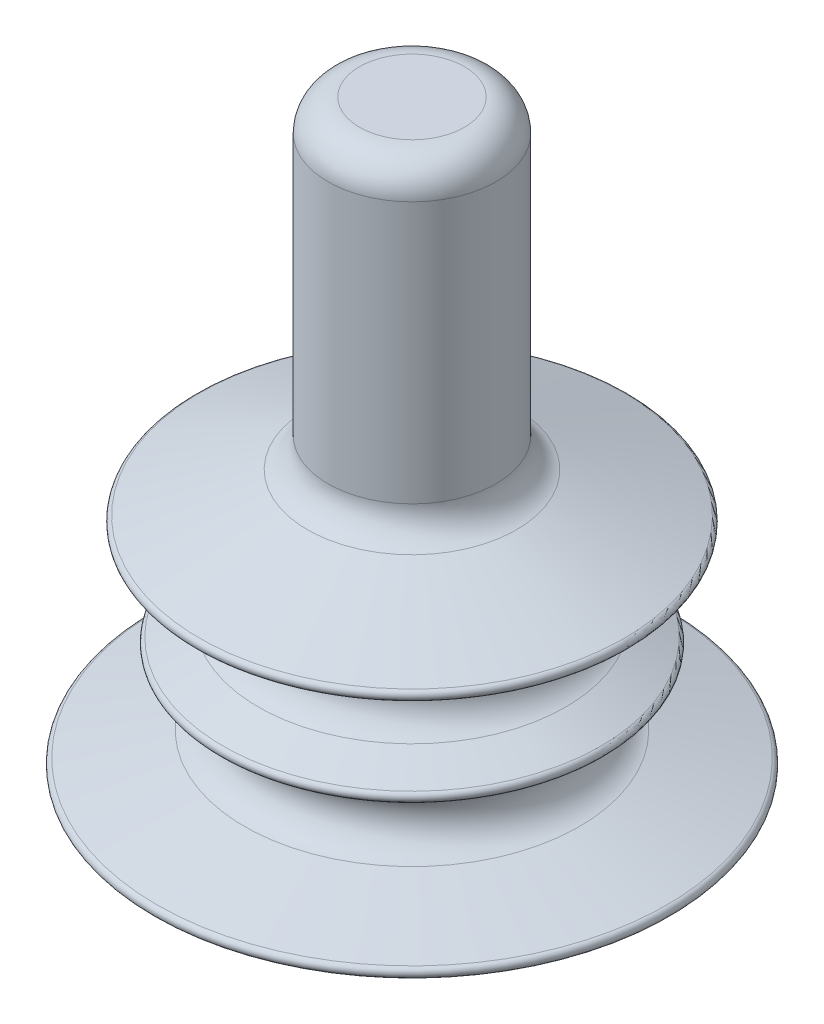
ISO-10303-21;
HEADER;
FILE_DESCRIPTION(('STEP AP214'),'2;1');
FILE_NAME('part.step','',(''),(''),'','','');
FILE_SCHEMA(('AUTOMOTIVE_DESIGN { 1 0 10303 214 1 1 1 1 }'));
ENDSEC;
DATA;
#1=APPLICATION_CONTEXT('core data for automotive mechanical design processes');
#2=APPLICATION_PROTOCOL_DEFINITION('international standard','automotive_design',2000,#1);
#3=PRODUCT_CONTEXT('',#1,'mechanical');
#4=PRODUCT('Part','Part','',(#3));
#5=PRODUCT_RELATED_PRODUCT_CATEGORY('part','',(#4));
#6=PRODUCT_DEFINITION_FORMATION('','',#4);
#7=PRODUCT_DEFINITION_CONTEXT('part definition',#1,'design');
#8=PRODUCT_DEFINITION('design','',#6,#7);
#9=PRODUCT_DEFINITION_SHAPE('','',#8);
#10=(LENGTH_UNIT() NAMED_UNIT(*) SI_UNIT(.MILLI.,.METRE.));
#11=(NAMED_UNIT(*) PLANE_ANGLE_UNIT() SI_UNIT($,.RADIAN.));
#12=(NAMED_UNIT(*) SI_UNIT($,.STERADIAN.) SOLID_ANGLE_UNIT());
#13=UNCERTAINTY_MEASURE_WITH_UNIT(LENGTH_MEASURE(1.E-05),#10,'distance_accuracy_value','');
#14=(GEOMETRIC_REPRESENTATION_CONTEXT(3) GLOBAL_UNCERTAINTY_ASSIGNED_CONTEXT((#13)) GLOBAL_UNIT_ASSIGNED_CONTEXT((#10,
#11,#12)) REPRESENTATION_CONTEXT('',''));
#15=CARTESIAN_POINT('',(0.,0.,0.));
#16=DIRECTION('',(0.,0.,1.));
#17=DIRECTION('',(1.,0.,0.));
#18=AXIS2_PLACEMENT_3D('',#15,#16,#17);
#19=CARTESIAN_POINT('',(0.,65.,0.));
#20=DIRECTION('',(0.,-1.,0.));
#21=DIRECTION('',(0.,0.,-1.));
#22=AXIS2_PLACEMENT_3D('',#19,#20,#21);
#23=PLANE('',#22);
#24=CARTESIAN_POINT('',(0.,65.,0.));
#25=DIRECTION('',(0.,-1.,0.));
#26=DIRECTION('',(0.,0.,-1.));
#27=AXIS2_PLACEMENT_3D('',#24,#25,#26);
#28=CIRCLE('',#27,5.);
#29=CARTESIAN_POINT('',(0.,65.,-5.));
#30=VERTEX_POINT('',#29);
#31=EDGE_CURVE('E10',#30,#30,#28,.F.);
#32=ORIENTED_EDGE('',*,*,#31,.T.);
#33=EDGE_LOOP('',(#32));
#34=FACE_BOUND('',#33,.T.);
#35=ADVANCED_FACE('F31',(#34),#23,.F.);
#36=CARTESIAN_POINT('',(0.,0.,0.));
#37=DIRECTION('',(0.,-1.,0.));
#38=DIRECTION('',(0.,0.,-1.));
#39=AXIS2_PLACEMENT_3D('',#36,#37,#38);
#40=CYLINDRICAL_SURFACE('',#39,8.);
#41=CARTESIAN_POINT('',(0.,37.088040010864,0.));
#42=DIRECTION('',(0.,-1.,0.));
#43=DIRECTION('',(0.,0.,-1.));
#44=AXIS2_PLACEMENT_3D('',#41,#42,#43);
#45=CIRCLE('',#44,8.);
#46=CARTESIAN_POINT('',(0.,37.088040010864,-8.));
#47=VERTEX_POINT('',#46);
#48=EDGE_CURVE('E38',#47,#47,#45,.F.);
#49=ORIENTED_EDGE('',*,*,#48,.T.);
#50=EDGE_LOOP('',(#49));
#51=FACE_BOUND('',#50,.T.);
#52=CARTESIAN_POINT('',(0.,62.,0.));
#53=DIRECTION('',(0.,-1.,0.));
#54=DIRECTION('',(0.,0.,-1.));
#55=AXIS2_PLACEMENT_3D('',#52,#53,#54);
#56=CIRCLE('',#55,8.);
#57=CARTESIAN_POINT('',(0.,62.,-8.));
#58=VERTEX_POINT('',#57);
#59=EDGE_CURVE('E42',#58,#58,#56,.T.);
#60=ORIENTED_EDGE('',*,*,#59,.T.);
#61=EDGE_LOOP('',(#60));
#62=FACE_BOUND('',#61,.T.);
#63=ADVANCED_FACE('F108',(#51,#62),#40,.T.);
#64=CARTESIAN_POINT('',(0.,35.,0.));
#65=DIRECTION('',(0.,-1.,0.));
#66=DIRECTION('',(0.,0.,-1.));
#67=AXIS2_PLACEMENT_3D('',#64,#65,#66);
#68=CONICAL_SURFACE('',#67,8.,1.21609067478396);
#69=CARTESIAN_POINT('',(0.,34.2747937286929,0.));
#70=DIRECTION('',(0.,-1.,0.));
#71=DIRECTION('',(0.,0.,-1.));
#72=AXIS2_PLACEMENT_3D('',#69,#70,#71);
#73=CIRCLE('',#72,9.95805693252922);
#74=CARTESIAN_POINT('',(0.,34.2747937286929,-9.95805693252922));
#75=VERTEX_POINT('',#74);
#76=EDGE_CURVE('E46',#75,#75,#73,.T.);
#77=ORIENTED_EDGE('',*,*,#76,.T.);
#78=EDGE_LOOP('',(#77));
#79=FACE_BOUND('',#78,.T.);
#80=CARTESIAN_POINT('',(0.,30.4688743803619,0.));
#81=DIRECTION('',(0.,-1.,0.));
#82=DIRECTION('',(0.,0.,-1.));
#83=AXIS2_PLACEMENT_3D('',#80,#81,#82);
#84=CIRCLE('',#83,20.234039173023);
#85=CARTESIAN_POINT('',(0.,30.4688743803619,-20.234039173023));
#86=VERTEX_POINT('',#85);
#87=EDGE_CURVE('E69',#86,#86,#84,.T.);
#88=ORIENTED_EDGE('',*,*,#87,.F.);
#89=EDGE_LOOP('',(#88));
#90=FACE_BOUND('',#89,.T.);
#91=ADVANCED_FACE('F113',(#79,#90),#68,.T.);
#92=CARTESIAN_POINT('',(0.,30.,0.));
#93=DIRECTION('',(0.,-1.,0.));
#94=DIRECTION('',(0.,0.,-1.));
#95=AXIS2_PLACEMENT_3D('',#92,#93,#94);
#96=TOROIDAL_SURFACE('',#95,20.0603819951112,0.500000000000001);
#97=CARTESIAN_POINT('',(0.,29.5311256196381,0.));
#98=DIRECTION('',(0.,-1.,0.));
#99=DIRECTION('',(0.,0.,-1.));
#100=AXIS2_PLACEMENT_3D('',#97,#98,#99);
#101=CIRCLE('',#100,20.234039173023);
#102=CARTESIAN_POINT('',(0.,29.5311256196381,-20.234039173023));
#103=VERTEX_POINT('',#102);
#104=EDGE_CURVE('E72',#103,#103,#101,.T.);
#105=ORIENTED_EDGE('',*,*,#104,.F.);
#106=EDGE_LOOP('',(#105));
#107=FACE_BOUND('',#106,.T.);
#108=ORIENTED_EDGE('',*,*,#87,.T.);
#109=EDGE_LOOP('',(#108));
#110=FACE_BOUND('',#109,.T.);
#111=ADVANCED_FACE('F139',(#107,#110),#96,.T.);
#112=CARTESIAN_POINT('',(0.,29.5311256196381,0.));
#113=DIRECTION('',(0.,1.,0.));
#114=DIRECTION('',(0.,0.,1.));
#115=AXIS2_PLACEMENT_3D('',#112,#113,#114);
#116=CONICAL_SURFACE('',#115,20.234039173023,1.21609067478396);
#117=CARTESIAN_POINT('',(0.,27.5300053749923,0.));
#118=DIRECTION('',(0.,1.,0.));
#119=DIRECTION('',(0.,0.,1.));
#120=AXIS2_PLACEMENT_3D('',#117,#118,#119);
#121=CIRCLE('',#120,14.8310145124793);
#122=CARTESIAN_POINT('',(0.,27.5300053749923,14.8310145124793));
#123=VERTEX_POINT('',#122);
#124=EDGE_CURVE('E51',#123,#123,#121,.T.);
#125=ORIENTED_EDGE('',*,*,#124,.T.);
#126=EDGE_LOOP('',(#125));
#127=FACE_BOUND('',#126,.T.);
#128=ORIENTED_EDGE('',*,*,#104,.T.);
#129=EDGE_LOOP('',(#128));
#130=FACE_BOUND('',#129,.T.);
#131=ADVANCED_FACE('F143',(#127,#130),#116,.T.);
#132=CARTESIAN_POINT('',(0.,25.,0.));
#133=DIRECTION('',(0.,-1.,0.));
#134=DIRECTION('',(0.,0.,-1.));
#135=AXIS2_PLACEMENT_3D('',#132,#133,#134);
#136=CONICAL_SURFACE('',#135,8.,1.14416883366802);
#137=CARTESIAN_POINT('',(0.,21.9856596604334,0.));
#138=DIRECTION('',(0.,-1.,0.));
#139=DIRECTION('',(0.,0.,-1.));
#140=AXIS2_PLACEMENT_3D('',#137,#138,#139);
#141=CIRCLE('',#140,14.6315487470465);
#142=CARTESIAN_POINT('',(0.,21.9856596604334,-14.6315487470465));
#143=VERTEX_POINT('',#142);
#144=EDGE_CURVE('E54',#143,#143,#141,.T.);
#145=ORIENTED_EDGE('',*,*,#144,.T.);
#146=EDGE_LOOP('',(#145));
#147=FACE_BOUND('',#146,.T.);
#148=CARTESIAN_POINT('',(0.,20.4551832387313,0.));
#149=DIRECTION('',(0.,-1.,0.));
#150=DIRECTION('',(0.,0.,-1.));
#151=AXIS2_PLACEMENT_3D('',#148,#149,#150);
#152=CIRCLE('',#151,17.9985968747911);
#153=CARTESIAN_POINT('',(0.,20.4551832387313,-17.9985968747911));
#154=VERTEX_POINT('',#153);
#155=EDGE_CURVE('E75',#154,#154,#152,.T.);
#156=ORIENTED_EDGE('',*,*,#155,.F.);
#157=EDGE_LOOP('',(#156));
#158=FACE_BOUND('',#157,.T.);
#159=ADVANCED_FACE('F149',(#147,#158),#136,.T.);
#160=CARTESIAN_POINT('',(0.,20.,0.));
#161=DIRECTION('',(0.,-1.,0.));
#162=DIRECTION('',(0.,0.,-1.));
#163=AXIS2_PLACEMENT_3D('',#160,#161,#162);
#164=TOROIDAL_SURFACE('',#163,17.7916954026405,0.500000000000001);
#165=CARTESIAN_POINT('',(0.,19.5448167612687,0.));
#166=DIRECTION('',(0.,-1.,0.));
#167=DIRECTION('',(0.,0.,-1.));
#168=AXIS2_PLACEMENT_3D('',#165,#166,#167);
#169=CIRCLE('',#168,17.9985968747911);
#170=CARTESIAN_POINT('',(0.,19.5448167612687,-17.9985968747911));
#171=VERTEX_POINT('',#170);
#172=EDGE_CURVE('E78',#171,#171,#169,.T.);
#173=ORIENTED_EDGE('',*,*,#172,.F.);
#174=EDGE_LOOP('',(#173));
#175=FACE_BOUND('',#174,.T.);
#176=ORIENTED_EDGE('',*,*,#155,.T.);
#177=EDGE_LOOP('',(#176));
#178=FACE_BOUND('',#177,.T.);
#179=ADVANCED_FACE('F156',(#175,#178),#164,.T.);
#180=CARTESIAN_POINT('',(0.,19.5448167612687,0.));
#181=DIRECTION('',(0.,1.,0.));
#182=DIRECTION('',(0.,0.,1.));
#183=AXIS2_PLACEMENT_3D('',#180,#181,#182);
#184=CONICAL_SURFACE('',#183,17.9985968747911,1.14416883366802);
#185=CARTESIAN_POINT('',(0.,18.413702437768,0.));
#186=DIRECTION('',(0.,1.,0.));
#187=DIRECTION('',(0.,0.,1.));
#188=AXIS2_PLACEMENT_3D('',#185,#186,#187);
#189=CIRCLE('',#188,15.5101453630895);
#190=CARTESIAN_POINT('',(0.,18.413702437768,15.5101453630895));
#191=VERTEX_POINT('',#190);
#192=EDGE_CURVE('E57',#191,#191,#189,.T.);
#193=ORIENTED_EDGE('',*,*,#192,.T.);
#194=EDGE_LOOP('',(#193));
#195=FACE_BOUND('',#194,.T.);
#196=ORIENTED_EDGE('',*,*,#172,.T.);
#197=EDGE_LOOP('',(#196));
#198=FACE_BOUND('',#197,.T.);
#199=ADVANCED_FACE('F160',(#195,#198),#184,.T.);
#200=CARTESIAN_POINT('',(0.,15.,0.));
#201=DIRECTION('',(0.,-1.,0.));
#202=DIRECTION('',(0.,0.,-1.));
#203=AXIS2_PLACEMENT_3D('',#200,#201,#202);
#204=CONICAL_SURFACE('',#203,8.00000000000001,1.29984947645648);
#205=CARTESIAN_POINT('',(0.,12.7920492764903,0.));
#206=DIRECTION('',(0.,-1.,0.));
#207=DIRECTION('',(0.,0.,-1.));
#208=AXIS2_PLACEMENT_3D('',#205,#206,#207);
#209=CIRCLE('',#208,15.9486226046348);
#210=CARTESIAN_POINT('',(0.,12.7920492764903,-15.9486226046348));
#211=VERTEX_POINT('',#210);
#212=EDGE_CURVE('E60',#211,#211,#209,.T.);
#213=ORIENTED_EDGE('',*,*,#212,.T.);
#214=EDGE_LOOP('',(#213));
#215=FACE_BOUND('',#214,.T.);
#216=CARTESIAN_POINT('',(0.,10.481758954815,0.));
#217=DIRECTION('',(0.,-1.,0.));
#218=DIRECTION('',(0.,0.,-1.));
#219=AXIS2_PLACEMENT_3D('',#216,#217,#218);
#220=CIRCLE('',#219,24.2656677626661);
#221=CARTESIAN_POINT('',(0.,10.481758954815,-24.2656677626661));
#222=VERTEX_POINT('',#221);
#223=EDGE_CURVE('E81',#222,#222,#220,.T.);
#224=ORIENTED_EDGE('',*,*,#223,.F.);
#225=EDGE_LOOP('',(#224));
#226=FACE_BOUND('',#225,.T.);
#227=ADVANCED_FACE('F164',(#215,#226),#204,.T.);
#228=CARTESIAN_POINT('',(0.,9.99999999999999,0.));
#229=DIRECTION('',(0.,-1.,0.));
#230=DIRECTION('',(0.,0.,-1.));
#231=AXIS2_PLACEMENT_3D('',#228,#229,#230);
#232=TOROIDAL_SURFACE('',#231,24.1318458307731,0.5);
#233=CARTESIAN_POINT('',(0.,9.51824104518503,0.));
#234=DIRECTION('',(0.,-1.,0.));
#235=DIRECTION('',(0.,0.,-1.));
#236=AXIS2_PLACEMENT_3D('',#233,#234,#235);
#237=CIRCLE('',#236,24.2656677626661);
#238=CARTESIAN_POINT('',(0.,9.51824104518503,-24.2656677626661));
#239=VERTEX_POINT('',#238);
#240=EDGE_CURVE('E84',#239,#239,#237,.T.);
#241=ORIENTED_EDGE('',*,*,#240,.F.);
#242=EDGE_LOOP('',(#241));
#243=FACE_BOUND('',#242,.T.);
#244=ORIENTED_EDGE('',*,*,#223,.T.);
#245=EDGE_LOOP('',(#244));
#246=FACE_BOUND('',#245,.T.);
#247=ADVANCED_FACE('F104',(#243,#246),#232,.T.);
#248=CARTESIAN_POINT('',(0.,9.51824104518503,0.));
#249=DIRECTION('',(0.,1.,0.));
#250=DIRECTION('',(0.,0.,1.));
#251=AXIS2_PLACEMENT_3D('',#248,#249,#250);
#252=CONICAL_SURFACE('',#251,24.2656677626661,1.29984947645648);
#253=CARTESIAN_POINT('',(0.,5.61029678017826,0.));
#254=DIRECTION('',(0.,1.,0.));
#255=DIRECTION('',(0.,0.,1.));
#256=AXIS2_PLACEMENT_3D('',#253,#254,#255);
#257=CIRCLE('',#256,10.1970684086417);
#258=CARTESIAN_POINT('',(0.,5.61029678017826,10.1970684086417));
#259=VERTEX_POINT('',#258);
#260=EDGE_CURVE('E63',#259,#259,#257,.T.);
#261=ORIENTED_EDGE('',*,*,#260,.T.);
#262=EDGE_LOOP('',(#261));
#263=FACE_BOUND('',#262,.T.);
#264=ORIENTED_EDGE('',*,*,#240,.T.);
#265=EDGE_LOOP('',(#264));
#266=FACE_BOUND('',#265,.T.);
#267=ADVANCED_FACE('F95',(#263,#266),#252,.T.);
#268=CARTESIAN_POINT('',(0.,0.,0.));
#269=DIRECTION('',(0.,-1.,0.));
#270=DIRECTION('',(0.,0.,-1.));
#271=AXIS2_PLACEMENT_3D('',#268,#269,#270);
#272=CYLINDRICAL_SURFACE('',#271,8.);
#273=CARTESIAN_POINT('',(0.,2.71974305128844,0.));
#274=DIRECTION('',(0.,-1.,0.));
#275=DIRECTION('',(0.,0.,-1.));
#276=AXIS2_PLACEMENT_3D('',#273,#274,#275);
#277=CIRCLE('',#276,8.);
#278=CARTESIAN_POINT('',(0.,2.71974305128844,-8.));
#279=VERTEX_POINT('',#278);
#280=EDGE_CURVE('E66',#279,#279,#277,.T.);
#281=ORIENTED_EDGE('',*,*,#280,.T.);
#282=EDGE_LOOP('',(#281));
#283=FACE_BOUND('',#282,.T.);
#284=CARTESIAN_POINT('',(0.,0.,0.));
#285=DIRECTION('',(0.,-1.,0.));
#286=DIRECTION('',(0.,0.,-1.));
#287=AXIS2_PLACEMENT_3D('',#284,#285,#286);
#288=CIRCLE('',#287,8.);
#289=CARTESIAN_POINT('',(0.,0.,-8.));
#290=VERTEX_POINT('',#289);
#291=EDGE_CURVE('E87',#290,#290,#288,.T.);
#292=ORIENTED_EDGE('',*,*,#291,.F.);
#293=EDGE_LOOP('',(#292));
#294=FACE_BOUND('',#293,.T.);
#295=ADVANCED_FACE('F93',(#283,#294),#272,.T.);
#296=CARTESIAN_POINT('',(0.,0.,8.));
#297=DIRECTION('',(0.,1.,0.));
#298=DIRECTION('',(0.,0.,1.));
#299=AXIS2_PLACEMENT_3D('',#296,#297,#298);
#300=PLANE('',#299);
#301=ORIENTED_EDGE('',*,*,#291,.T.);
#302=EDGE_LOOP('',(#301));
#303=FACE_BOUND('',#302,.T.);
#304=ADVANCED_FACE('F91',(#303),#300,.F.);
#305=CARTESIAN_POINT('',(0.,2.71974305128844,0.));
#306=DIRECTION('',(0.,-1.,0.));
#307=DIRECTION('',(0.,0.,-1.));
#308=AXIS2_PLACEMENT_3D('',#305,#306,#307);
#309=TOROIDAL_SURFACE('',#308,11.,3.);
#310=ORIENTED_EDGE('',*,*,#260,.F.);
#311=EDGE_LOOP('',(#310));
#312=FACE_BOUND('',#311,.T.);
#313=ORIENTED_EDGE('',*,*,#280,.F.);
#314=EDGE_LOOP('',(#313));
#315=FACE_BOUND('',#314,.T.);
#316=ADVANCED_FACE('F102',(#312,#315),#309,.F.);
#317=CARTESIAN_POINT('',(0.,15.6826030053802,0.));
#318=DIRECTION('',(0.,-1.,0.));
#319=DIRECTION('',(0.,0.,-1.));
#320=AXIS2_PLACEMENT_3D('',#317,#318,#319);
#321=TOROIDAL_SURFACE('',#320,16.7515541959931,3.);
#322=ORIENTED_EDGE('',*,*,#192,.F.);
#323=EDGE_LOOP('',(#322));
#324=FACE_BOUND('',#323,.T.);
#325=ORIENTED_EDGE('',*,*,#212,.F.);
#326=EDGE_LOOP('',(#325));
#327=FACE_BOUND('',#326,.T.);
#328=ADVANCED_FACE('F119',(#324,#327),#321,.F.);
#329=CARTESIAN_POINT('',(0.,24.7167590928212,0.));
#330=DIRECTION('',(0.,-1.,0.));
#331=DIRECTION('',(0.,0.,-1.));
#332=AXIS2_PLACEMENT_3D('',#329,#330,#331);
#333=TOROIDAL_SURFACE('',#332,15.8729575799501,3.);
#334=ORIENTED_EDGE('',*,*,#124,.F.);
#335=EDGE_LOOP('',(#334));
#336=FACE_BOUND('',#335,.T.);
#337=ORIENTED_EDGE('',*,*,#144,.F.);
#338=EDGE_LOOP('',(#337));
#339=FACE_BOUND('',#338,.T.);
#340=ADVANCED_FACE('F123',(#336,#339),#333,.F.);
#341=CARTESIAN_POINT('',(0.,37.088040010864,0.));
#342=DIRECTION('',(0.,-1.,0.));
#343=DIRECTION('',(0.,0.,-1.));
#344=AXIS2_PLACEMENT_3D('',#341,#342,#343);
#345=TOROIDAL_SURFACE('',#344,11.,3.);
#346=ORIENTED_EDGE('',*,*,#48,.F.);
#347=EDGE_LOOP('',(#346));
#348=FACE_BOUND('',#347,.T.);
#349=ORIENTED_EDGE('',*,*,#76,.F.);
#350=EDGE_LOOP('',(#349));
#351=FACE_BOUND('',#350,.T.);
#352=ADVANCED_FACE('F126',(#348,#351),#345,.F.);
#353=CARTESIAN_POINT('',(0.,62.,0.));
#354=DIRECTION('',(0.,-1.,0.));
#355=DIRECTION('',(0.,0.,-1.));
#356=AXIS2_PLACEMENT_3D('',#353,#354,#355);
#357=TOROIDAL_SURFACE('',#356,5.,3.);
#358=ORIENTED_EDGE('',*,*,#31,.F.);
#359=EDGE_LOOP('',(#358));
#360=FACE_BOUND('',#359,.T.);
#361=ORIENTED_EDGE('',*,*,#59,.F.);
#362=EDGE_LOOP('',(#361));
#363=FACE_BOUND('',#362,.T.);
#364=ADVANCED_FACE('F33',(#360,#363),#357,.T.);
#365=CLOSED_SHELL('',(#35,#63,#91,#111,#131,#159,#179,#199,#227,#247,#267,#295,#304,#316,#328,
#340,#352,#364));
#366=MANIFOLD_SOLID_BREP('B2',#365);
#367=ADVANCED_BREP_SHAPE_REPRESENTATION('',(#18,#366),#14);
#368=SHAPE_DEFINITION_REPRESENTATION(#9,#367);
ENDSEC;
END-ISO-10303-21;
